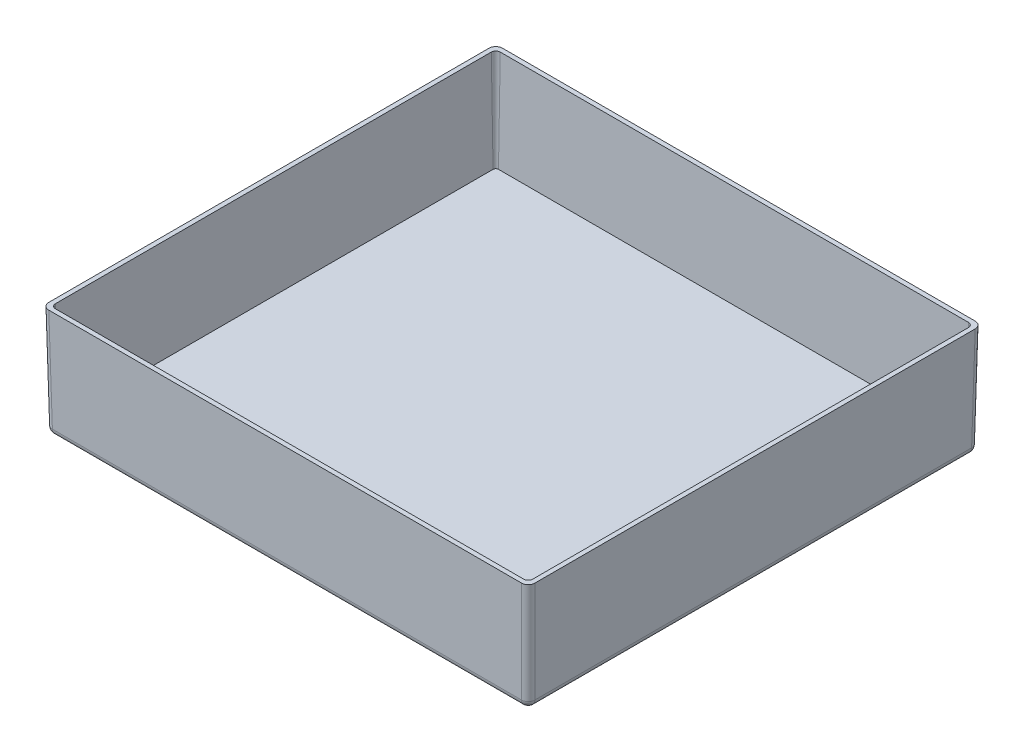
ISO-10303-21;
HEADER;
FILE_DESCRIPTION(('STEP AP214'),'2;1');
FILE_NAME('part.step','',(''),(''),'','','');
FILE_SCHEMA(('AUTOMOTIVE_DESIGN { 1 0 10303 214 1 1 1 1 }'));
ENDSEC;
DATA;
#1=APPLICATION_CONTEXT('core data for automotive mechanical design processes');
#2=APPLICATION_PROTOCOL_DEFINITION('international standard','automotive_design',2000,#1);
#3=PRODUCT_CONTEXT('',#1,'mechanical');
#4=PRODUCT('Part','Part','',(#3));
#5=PRODUCT_RELATED_PRODUCT_CATEGORY('part','',(#4));
#6=PRODUCT_DEFINITION_FORMATION('','',#4);
#7=PRODUCT_DEFINITION_CONTEXT('part definition',#1,'design');
#8=PRODUCT_DEFINITION('design','',#6,#7);
#9=PRODUCT_DEFINITION_SHAPE('','',#8);
#10=(LENGTH_UNIT() NAMED_UNIT(*) SI_UNIT(.MILLI.,.METRE.));
#11=(NAMED_UNIT(*) PLANE_ANGLE_UNIT() SI_UNIT($,.RADIAN.));
#12=(NAMED_UNIT(*) SI_UNIT($,.STERADIAN.) SOLID_ANGLE_UNIT());
#13=UNCERTAINTY_MEASURE_WITH_UNIT(LENGTH_MEASURE(1.E-05),#10,'distance_accuracy_value','');
#14=(GEOMETRIC_REPRESENTATION_CONTEXT(3) GLOBAL_UNCERTAINTY_ASSIGNED_CONTEXT((#13)) GLOBAL_UNIT_ASSIGNED_CONTEXT((#10,
#11,#12)) REPRESENTATION_CONTEXT('',''));
#15=CARTESIAN_POINT('',(0.,0.,0.));
#16=DIRECTION('',(0.,0.,1.));
#17=DIRECTION('',(1.,0.,0.));
#18=AXIS2_PLACEMENT_3D('',#15,#16,#17);
#19=CARTESIAN_POINT('',(107.75,0.,100.5));
#20=DIRECTION('',(0.999847695156391,-0.0174524064372835,0.));
#21=DIRECTION('',(0.0174524064372835,0.999847695156391,0.));
#22=AXIS2_PLACEMENT_3D('',#19,#20,#21);
#23=PLANE('',#22);
#24=DIRECTION('',(0.,0.,-1.));
#25=VECTOR('',#24,1.);
#26=CARTESIAN_POINT('',(107.801451296122,2.94764278068815,-100.5));
#27=LINE('',#26,#25);
#28=CARTESIAN_POINT('',(107.801451296122,2.94764278068815,97.551908210653));
#29=VERTEX_POINT('',#28);
#30=CARTESIAN_POINT('',(107.801451296122,2.94764278068815,-97.5519082106529));
#31=VERTEX_POINT('',#30);
#32=EDGE_CURVE('E280',#29,#31,#27,.T.);
#33=ORIENTED_EDGE('',*,*,#32,.T.);
#34=DIRECTION('',(0.0174497491606827,0.999695459881888,-0.0174497491606827));
#35=VECTOR('',#34,1.);
#36=CARTESIAN_POINT('',(107.68971009921,-3.45400610299427,-97.4401670137406));
#37=LINE('',#36,#35);
#38=CARTESIAN_POINT('',(108.605298181483,49.,-98.3557550960135));
#39=VERTEX_POINT('',#38);
#40=EDGE_CURVE('E282',#31,#39,#37,.T.);
#41=ORIENTED_EDGE('',*,*,#40,.T.);
#42=DIRECTION('',(0.,0.,1.));
#43=VECTOR('',#42,1.);
#44=CARTESIAN_POINT('',(108.605298181483,49.,0.));
#45=LINE('',#44,#43);
#46=CARTESIAN_POINT('',(108.605298181483,49.,98.3557550960135));
#47=VERTEX_POINT('',#46);
#48=EDGE_CURVE('E236',#47,#39,#45,.F.);
#49=ORIENTED_EDGE('',*,*,#48,.F.);
#50=DIRECTION('',(0.0174497491606827,0.999695459881888,0.0174497491606827));
#51=VECTOR('',#50,1.);
#52=CARTESIAN_POINT('',(107.75091334211,0.0523253344201977,97.5013702566405));
#53=LINE('',#52,#51);
#54=EDGE_CURVE('E278',#47,#29,#53,.F.);
#55=ORIENTED_EDGE('',*,*,#54,.T.);
#56=EDGE_LOOP('',(#33,#41,#49,#55));
#57=FACE_BOUND('',#56,.T.);
#58=ADVANCED_FACE('F37',(#57),#23,.T.);
#59=CARTESIAN_POINT('',(-107.75,0.,-100.5));
#60=DIRECTION('',(0.,-0.0174524064372835,-0.999847695156391));
#61=DIRECTION('',(0.,0.999847695156391,-0.0174524064372835));
#62=AXIS2_PLACEMENT_3D('',#59,#60,#61);
#63=PLANE('',#62);
#64=DIRECTION('',(-1.,0.,0.));
#65=VECTOR('',#64,1.);
#66=CARTESIAN_POINT('',(-107.75,2.94764278068815,-100.551451296122));
#67=LINE('',#66,#65);
#68=CARTESIAN_POINT('',(104.801908210653,2.94764278068815,-100.551451296122));
#69=VERTEX_POINT('',#68);
#70=CARTESIAN_POINT('',(-104.801908210653,2.94764278068815,-100.551451296122));
#71=VERTEX_POINT('',#70);
#72=EDGE_CURVE('E250',#69,#71,#67,.T.);
#73=ORIENTED_EDGE('',*,*,#72,.T.);
#74=DIRECTION('',(-0.0174497491606827,0.999695459881888,-0.0174497491606827));
#75=VECTOR('',#74,1.);
#76=CARTESIAN_POINT('',(-104.751370256641,0.0523253344201977,-100.50091334211));
#77=LINE('',#76,#75);
#78=CARTESIAN_POINT('',(-105.605755096014,49.,-101.355298181483));
#79=VERTEX_POINT('',#78);
#80=EDGE_CURVE('E253',#71,#79,#77,.T.);
#81=ORIENTED_EDGE('',*,*,#80,.T.);
#82=DIRECTION('',(1.,0.,0.));
#83=VECTOR('',#82,1.);
#84=CARTESIAN_POINT('',(0.,49.,-101.355298181483));
#85=LINE('',#84,#83);
#86=CARTESIAN_POINT('',(105.605755096013,49.,-101.355298181483));
#87=VERTEX_POINT('',#86);
#88=EDGE_CURVE('E239',#87,#79,#85,.F.);
#89=ORIENTED_EDGE('',*,*,#88,.F.);
#90=DIRECTION('',(0.0174497491606827,0.999695459881888,-0.0174497491606827));
#91=VECTOR('',#90,1.);
#92=CARTESIAN_POINT('',(104.685751854427,-3.70695041066845,-100.435294939896));
#93=LINE('',#92,#91);
#94=EDGE_CURVE('E248',#87,#69,#93,.F.);
#95=ORIENTED_EDGE('',*,*,#94,.T.);
#96=EDGE_LOOP('',(#73,#81,#89,#95));
#97=FACE_BOUND('',#96,.T.);
#98=ADVANCED_FACE('F341',(#97),#63,.T.);
#99=CARTESIAN_POINT('',(-107.75,0.,100.5));
#100=DIRECTION('',(-0.999847695156391,-0.0174524064372835,0.));
#101=DIRECTION('',(0.0174524064372835,-0.999847695156391,0.));
#102=AXIS2_PLACEMENT_3D('',#99,#100,#101);
#103=PLANE('',#102);
#104=DIRECTION('',(0.,0.,-1.));
#105=VECTOR('',#104,1.);
#106=CARTESIAN_POINT('',(-108.605298181483,49.,0.));
#107=LINE('',#106,#105);
#108=CARTESIAN_POINT('',(-108.605298181483,49.,-98.3557550960135));
#109=VERTEX_POINT('',#108);
#110=CARTESIAN_POINT('',(-108.605298181483,49.,98.3557550960135));
#111=VERTEX_POINT('',#110);
#112=EDGE_CURVE('E242',#109,#111,#107,.F.);
#113=ORIENTED_EDGE('',*,*,#112,.F.);
#114=DIRECTION('',(-0.0174497491606827,0.999695459881888,-0.0174497491606827));
#115=VECTOR('',#114,1.);
#116=CARTESIAN_POINT('',(-107.68971009921,-3.45400610299427,-97.4401670137405));
#117=LINE('',#116,#115);
#118=CARTESIAN_POINT('',(-107.801451296122,2.94764278068815,-97.5519082106529));
#119=VERTEX_POINT('',#118);
#120=EDGE_CURVE('E268',#109,#119,#117,.F.);
#121=ORIENTED_EDGE('',*,*,#120,.T.);
#122=DIRECTION('',(0.,0.,1.));
#123=VECTOR('',#122,1.);
#124=CARTESIAN_POINT('',(-107.801451296122,2.94764278068815,100.5));
#125=LINE('',#124,#123);
#126=CARTESIAN_POINT('',(-107.801451296122,2.94764278068815,97.551908210653));
#127=VERTEX_POINT('',#126);
#128=EDGE_CURVE('E266',#119,#127,#125,.T.);
#129=ORIENTED_EDGE('',*,*,#128,.T.);
#130=DIRECTION('',(-0.0174497491606827,0.999695459881888,0.0174497491606827));
#131=VECTOR('',#130,1.);
#132=CARTESIAN_POINT('',(-107.75091334211,0.0523253344201977,97.5013702566405));
#133=LINE('',#132,#131);
#134=EDGE_CURVE('E264',#127,#111,#133,.T.);
#135=ORIENTED_EDGE('',*,*,#134,.T.);
#136=EDGE_LOOP('',(#113,#121,#129,#135));
#137=FACE_BOUND('',#136,.T.);
#138=ADVANCED_FACE('F351',(#137),#103,.T.);
#139=CARTESIAN_POINT('',(-107.75,0.,100.5));
#140=DIRECTION('',(0.,-0.0174524064372835,0.999847695156391));
#141=DIRECTION('',(0.,-0.999847695156391,-0.0174524064372835));
#142=AXIS2_PLACEMENT_3D('',#139,#140,#141);
#143=PLANE('',#142);
#144=DIRECTION('',(1.,0.,0.));
#145=VECTOR('',#144,1.);
#146=CARTESIAN_POINT('',(107.75,2.94764278068815,100.551451296122));
#147=LINE('',#146,#145);
#148=CARTESIAN_POINT('',(-104.801908210653,2.94764278068815,100.551451296122));
#149=VERTEX_POINT('',#148);
#150=CARTESIAN_POINT('',(104.801908210653,2.94764278068815,100.551451296122));
#151=VERTEX_POINT('',#150);
#152=EDGE_CURVE('E46',#149,#151,#147,.T.);
#153=ORIENTED_EDGE('',*,*,#152,.T.);
#154=DIRECTION('',(0.0174497491606827,0.999695459881888,0.0174497491606827));
#155=VECTOR('',#154,1.);
#156=CARTESIAN_POINT('',(104.685751854427,-3.70695041066845,100.435294939896));
#157=LINE('',#156,#155);
#158=CARTESIAN_POINT('',(105.605755096013,49.,101.355298181483));
#159=VERTEX_POINT('',#158);
#160=EDGE_CURVE('E11',#151,#159,#157,.T.);
#161=ORIENTED_EDGE('',*,*,#160,.T.);
#162=DIRECTION('',(-1.,0.,0.));
#163=VECTOR('',#162,1.);
#164=CARTESIAN_POINT('',(0.,49.,101.355298181483));
#165=LINE('',#164,#163);
#166=CARTESIAN_POINT('',(-105.605755096014,49.,101.355298181483));
#167=VERTEX_POINT('',#166);
#168=EDGE_CURVE('E245',#167,#159,#165,.F.);
#169=ORIENTED_EDGE('',*,*,#168,.F.);
#170=DIRECTION('',(-0.0174497491606827,0.999695459881888,0.0174497491606827));
#171=VECTOR('',#170,1.);
#172=CARTESIAN_POINT('',(-104.751370256641,0.0523253344201977,100.50091334211));
#173=LINE('',#172,#171);
#174=EDGE_CURVE('E284',#167,#149,#173,.F.);
#175=ORIENTED_EDGE('',*,*,#174,.T.);
#176=EDGE_LOOP('',(#153,#161,#169,#175));
#177=FACE_BOUND('',#176,.T.);
#178=ADVANCED_FACE('F386',(#177),#143,.T.);
#179=CARTESIAN_POINT('',(0.,49.,0.));
#180=DIRECTION('',(0.,-1.,0.));
#181=DIRECTION('',(0.,0.,-1.));
#182=AXIS2_PLACEMENT_3D('',#179,#180,#181);
#183=PLANE('',#182);
#184=DIRECTION('',(1.,0.,0.));
#185=VECTOR('',#184,1.);
#186=CARTESIAN_POINT('',(-104.605298181483,49.,99.3552981814827));
#187=LINE('',#186,#185);
#188=CARTESIAN_POINT('',(-104.605298181483,49.,99.3552981814827));
#189=VERTEX_POINT('',#188);
#190=CARTESIAN_POINT('',(104.605298181483,49.,99.3552981814827));
#191=VERTEX_POINT('',#190);
#192=EDGE_CURVE('E177',#189,#191,#187,.T.);
#193=ORIENTED_EDGE('',*,*,#192,.F.);
#194=CARTESIAN_POINT('',(-104.605298181483,49.,97.3552981814827));
#195=DIRECTION('',(0.,1.,0.));
#196=DIRECTION('',(0.,0.,-1.));
#197=AXIS2_PLACEMENT_3D('',#194,#195,#196);
#198=CIRCLE('',#197,2.);
#199=CARTESIAN_POINT('',(-106.605298181483,49.,97.3552981814827));
#200=VERTEX_POINT('',#199);
#201=EDGE_CURVE('E54',#200,#189,#198,.T.);
#202=ORIENTED_EDGE('',*,*,#201,.F.);
#203=DIRECTION('',(0.,0.,1.));
#204=VECTOR('',#203,1.);
#205=CARTESIAN_POINT('',(-106.605298181483,49.,97.3552981814827));
#206=LINE('',#205,#204);
#207=CARTESIAN_POINT('',(-106.605298181483,49.,-97.3552981814826));
#208=VERTEX_POINT('',#207);
#209=EDGE_CURVE('E199',#208,#200,#206,.T.);
#210=ORIENTED_EDGE('',*,*,#209,.F.);
#211=CARTESIAN_POINT('',(-104.605298181483,49.,-97.3552981814827));
#212=DIRECTION('',(0.,1.,0.));
#213=DIRECTION('',(0.,0.,-1.));
#214=AXIS2_PLACEMENT_3D('',#211,#212,#213);
#215=CIRCLE('',#214,2.);
#216=CARTESIAN_POINT('',(-104.605298181483,49.,-99.3552981814827));
#217=VERTEX_POINT('',#216);
#218=EDGE_CURVE('E196',#217,#208,#215,.T.);
#219=ORIENTED_EDGE('',*,*,#218,.F.);
#220=DIRECTION('',(-1.,0.,0.));
#221=VECTOR('',#220,1.);
#222=CARTESIAN_POINT('',(-104.605298181483,49.,-99.3552981814827));
#223=LINE('',#222,#221);
#224=CARTESIAN_POINT('',(104.605298181483,49.,-99.3552981814827));
#225=VERTEX_POINT('',#224);
#226=EDGE_CURVE('E193',#225,#217,#223,.T.);
#227=ORIENTED_EDGE('',*,*,#226,.F.);
#228=CARTESIAN_POINT('',(104.605298181483,49.,-97.3552981814827));
#229=DIRECTION('',(0.,1.,0.));
#230=DIRECTION('',(0.,0.,-1.));
#231=AXIS2_PLACEMENT_3D('',#228,#229,#230);
#232=CIRCLE('',#231,2.);
#233=CARTESIAN_POINT('',(106.605298181483,49.,-97.3552981814826));
#234=VERTEX_POINT('',#233);
#235=EDGE_CURVE('E187',#234,#225,#232,.T.);
#236=ORIENTED_EDGE('',*,*,#235,.F.);
#237=DIRECTION('',(0.,0.,-1.));
#238=VECTOR('',#237,1.);
#239=CARTESIAN_POINT('',(106.605298181483,49.,97.3552981814827));
#240=LINE('',#239,#238);
#241=CARTESIAN_POINT('',(106.605298181483,49.,97.3552981814827));
#242=VERTEX_POINT('',#241);
#243=EDGE_CURVE('E185',#242,#234,#240,.T.);
#244=ORIENTED_EDGE('',*,*,#243,.F.);
#245=CARTESIAN_POINT('',(104.605298181483,49.,97.3552981814827));
#246=DIRECTION('',(0.,1.,0.));
#247=DIRECTION('',(0.,0.,1.));
#248=AXIS2_PLACEMENT_3D('',#245,#246,#247);
#249=CIRCLE('',#248,2.);
#250=EDGE_CURVE('E166',#191,#242,#249,.T.);
#251=ORIENTED_EDGE('',*,*,#250,.F.);
#252=EDGE_LOOP('',(#193,#202,#210,#219,#227,#236,#244,#251));
#253=FACE_BOUND('',#252,.T.);
#254=ORIENTED_EDGE('',*,*,#88,.T.);
#255=CARTESIAN_POINT('',(-105.604841197351,49.,-98.3548411973509));
#256=DIRECTION('',(0.,-1.,0.));
#257=DIRECTION('',(0.707106781186548,0.,0.707106781186548));
#258=AXIS2_PLACEMENT_3D('',#255,#256,#257);
#259=ELLIPSE('',#258,3.00091389867315,3.);
#260=EDGE_CURVE('E276',#79,#109,#259,.F.);
#261=ORIENTED_EDGE('',*,*,#260,.T.);
#262=ORIENTED_EDGE('',*,*,#112,.T.);
#263=CARTESIAN_POINT('',(-105.604841197351,49.,98.354841197351));
#264=DIRECTION('',(0.,-1.,0.));
#265=DIRECTION('',(0.707106781186548,0.,-0.707106781186548));
#266=AXIS2_PLACEMENT_3D('',#263,#264,#265);
#267=ELLIPSE('',#266,3.00091389867315,3.);
#268=EDGE_CURVE('E270',#111,#167,#267,.F.);
#269=ORIENTED_EDGE('',*,*,#268,.T.);
#270=ORIENTED_EDGE('',*,*,#168,.T.);
#271=CARTESIAN_POINT('',(105.604841197351,49.,98.354841197351));
#272=DIRECTION('',(0.,-1.,0.));
#273=DIRECTION('',(-0.707106781186548,0.,-0.707106781186548));
#274=AXIS2_PLACEMENT_3D('',#271,#272,#273);
#275=ELLIPSE('',#274,3.00091389867315,3.);
#276=EDGE_CURVE('E272',#159,#47,#275,.F.);
#277=ORIENTED_EDGE('',*,*,#276,.T.);
#278=ORIENTED_EDGE('',*,*,#48,.T.);
#279=CARTESIAN_POINT('',(105.604841197351,49.,-98.3548411973509));
#280=DIRECTION('',(0.,-1.,0.));
#281=DIRECTION('',(-0.707106781186548,0.,0.707106781186548));
#282=AXIS2_PLACEMENT_3D('',#279,#280,#281);
#283=ELLIPSE('',#282,3.00091389867315,3.);
#284=EDGE_CURVE('E274',#39,#87,#283,.F.);
#285=ORIENTED_EDGE('',*,*,#284,.T.);
#286=EDGE_LOOP('',(#254,#261,#262,#269,#270,#277,#278,#285));
#287=FACE_BOUND('',#286,.T.);
#288=ADVANCED_FACE('F181',(#253,#287),#183,.F.);
#289=CARTESIAN_POINT('',(0.,0.,0.));
#290=DIRECTION('',(0.,-1.,0.));
#291=DIRECTION('',(0.,0.,-1.));
#292=AXIS2_PLACEMENT_3D('',#289,#290,#291);
#293=PLANE('',#292);
#294=DIRECTION('',(0.,0.,-1.));
#295=VECTOR('',#294,1.);
#296=CARTESIAN_POINT('',(-104.801908210653,0.,-100.5));
#297=LINE('',#296,#295);
#298=CARTESIAN_POINT('',(-104.801908210653,0.,97.551908210653));
#299=VERTEX_POINT('',#298);
#300=CARTESIAN_POINT('',(-104.801908210653,0.,-97.5519082106529));
#301=VERTEX_POINT('',#300);
#302=EDGE_CURVE('E257',#299,#301,#297,.T.);
#303=ORIENTED_EDGE('',*,*,#302,.T.);
#304=DIRECTION('',(1.,0.,0.));
#305=VECTOR('',#304,1.);
#306=CARTESIAN_POINT('',(107.75,0.,-97.5519082106529));
#307=LINE('',#306,#305);
#308=CARTESIAN_POINT('',(104.801908210653,0.,-97.5519082106529));
#309=VERTEX_POINT('',#308);
#310=EDGE_CURVE('E261',#301,#309,#307,.T.);
#311=ORIENTED_EDGE('',*,*,#310,.T.);
#312=DIRECTION('',(0.,0.,1.));
#313=VECTOR('',#312,1.);
#314=CARTESIAN_POINT('',(104.801908210653,0.,100.5));
#315=LINE('',#314,#313);
#316=CARTESIAN_POINT('',(104.801908210653,0.,97.551908210653));
#317=VERTEX_POINT('',#316);
#318=EDGE_CURVE('E259',#309,#317,#315,.T.);
#319=ORIENTED_EDGE('',*,*,#318,.T.);
#320=DIRECTION('',(-1.,0.,0.));
#321=VECTOR('',#320,1.);
#322=CARTESIAN_POINT('',(-107.75,0.,97.551908210653));
#323=LINE('',#322,#321);
#324=EDGE_CURVE('E255',#317,#299,#323,.T.);
#325=ORIENTED_EDGE('',*,*,#324,.T.);
#326=EDGE_LOOP('',(#303,#311,#319,#325));
#327=FACE_BOUND('',#326,.T.);
#328=ADVANCED_FACE('F368',(#327),#293,.T.);
#329=CARTESIAN_POINT('',(104.75137025664,0.104682553732048,97.5013702566405));
#330=DIRECTION('',(-0.0174497491606827,-0.999695459881887,-0.0174497491606827));
#331=DIRECTION('',(0.,0.0174524064372835,-0.999847695156391));
#332=AXIS2_PLACEMENT_3D('',#329,#330,#331);
#333=CYLINDRICAL_SURFACE('',#332,3.);
#334=ORIENTED_EDGE('',*,*,#276,.F.);
#335=ORIENTED_EDGE('',*,*,#160,.F.);
#336=CARTESIAN_POINT('',(104.801908210653,3.,97.551908210653));
#337=DIRECTION('',(-0.0174497491606828,-0.999695459881888,-0.0174497491606828));
#338=DIRECTION('',(0.,0.0174524064372836,-0.999847695156391));
#339=AXIS2_PLACEMENT_3D('',#336,#337,#338);
#340=CIRCLE('',#339,3.);
#341=EDGE_CURVE('E313',#29,#151,#340,.T.);
#342=ORIENTED_EDGE('',*,*,#341,.F.);
#343=ORIENTED_EDGE('',*,*,#54,.F.);
#344=EDGE_LOOP('',(#334,#335,#342,#343));
#345=FACE_BOUND('',#344,.T.);
#346=ADVANCED_FACE('F39',(#345),#333,.T.);
#347=CARTESIAN_POINT('',(-104.751370256641,0.104682553732048,97.5013702566405));
#348=DIRECTION('',(0.0174497491606827,-0.999695459881887,-0.0174497491606827));
#349=DIRECTION('',(0.,0.0174524064372835,-0.999847695156391));
#350=AXIS2_PLACEMENT_3D('',#347,#348,#349);
#351=CYLINDRICAL_SURFACE('',#350,3.);
#352=ORIENTED_EDGE('',*,*,#268,.F.);
#353=ORIENTED_EDGE('',*,*,#134,.F.);
#354=CARTESIAN_POINT('',(-104.801908210653,3.,97.551908210653));
#355=DIRECTION('',(0.0174497491606828,-0.999695459881888,-0.0174497491606828));
#356=DIRECTION('',(0.,0.0174524064372836,-0.999847695156391));
#357=AXIS2_PLACEMENT_3D('',#354,#355,#356);
#358=CIRCLE('',#357,3.);
#359=EDGE_CURVE('E311',#149,#127,#358,.T.);
#360=ORIENTED_EDGE('',*,*,#359,.F.);
#361=ORIENTED_EDGE('',*,*,#174,.F.);
#362=EDGE_LOOP('',(#352,#353,#360,#361));
#363=FACE_BOUND('',#362,.T.);
#364=ADVANCED_FACE('F356',(#363),#351,.T.);
#365=CARTESIAN_POINT('',(-107.75,3.,97.551908210653));
#366=DIRECTION('',(1.,0.,0.));
#367=DIRECTION('',(0.,0.,-1.));
#368=AXIS2_PLACEMENT_3D('',#365,#366,#367);
#369=CYLINDRICAL_SURFACE('',#368,3.);
#370=CARTESIAN_POINT('',(104.801908210653,3.,97.551908210653));
#371=DIRECTION('',(1.,0.,0.));
#372=DIRECTION('',(0.,0.,-1.));
#373=AXIS2_PLACEMENT_3D('',#370,#371,#372);
#374=CIRCLE('',#373,3.);
#375=EDGE_CURVE('E41',#151,#317,#374,.T.);
#376=ORIENTED_EDGE('',*,*,#375,.F.);
#377=ORIENTED_EDGE('',*,*,#152,.F.);
#378=CARTESIAN_POINT('',(-104.801908210653,3.,97.551908210653));
#379=DIRECTION('',(-1.,0.,0.));
#380=DIRECTION('',(0.,0.,1.));
#381=AXIS2_PLACEMENT_3D('',#378,#379,#380);
#382=CIRCLE('',#381,3.);
#383=EDGE_CURVE('E308',#299,#149,#382,.T.);
#384=ORIENTED_EDGE('',*,*,#383,.F.);
#385=ORIENTED_EDGE('',*,*,#324,.F.);
#386=EDGE_LOOP('',(#376,#377,#384,#385));
#387=FACE_BOUND('',#386,.T.);
#388=ADVANCED_FACE('F369',(#387),#369,.T.);
#389=CARTESIAN_POINT('',(104.801908210653,3.,97.551908210653));
#390=DIRECTION('',(0.,-1.,0.));
#391=DIRECTION('',(0.,0.,-1.));
#392=AXIS2_PLACEMENT_3D('',#389,#390,#391);
#393=SPHERICAL_SURFACE('',#392,3.);
#394=ORIENTED_EDGE('',*,*,#341,.T.);
#395=ORIENTED_EDGE('',*,*,#375,.T.);
#396=CARTESIAN_POINT('',(104.801908210653,3.,97.551908210653));
#397=DIRECTION('',(0.,0.,1.));
#398=DIRECTION('',(1.,0.,0.));
#399=AXIS2_PLACEMENT_3D('',#396,#397,#398);
#400=CIRCLE('',#399,3.);
#401=EDGE_CURVE('E305',#29,#317,#400,.F.);
#402=ORIENTED_EDGE('',*,*,#401,.F.);
#403=EDGE_LOOP('',(#394,#395,#402));
#404=FACE_BOUND('',#403,.T.);
#405=ADVANCED_FACE('F320',(#404),#393,.T.);
#406=CARTESIAN_POINT('',(-104.801908210653,3.,97.551908210653));
#407=DIRECTION('',(0.,-1.,0.));
#408=DIRECTION('',(0.,0.,-1.));
#409=AXIS2_PLACEMENT_3D('',#406,#407,#408);
#410=SPHERICAL_SURFACE('',#409,3.);
#411=ORIENTED_EDGE('',*,*,#383,.T.);
#412=ORIENTED_EDGE('',*,*,#359,.T.);
#413=CARTESIAN_POINT('',(-104.801908210653,3.,97.551908210653));
#414=DIRECTION('',(0.,0.,1.));
#415=DIRECTION('',(1.,0.,0.));
#416=AXIS2_PLACEMENT_3D('',#413,#414,#415);
#417=CIRCLE('',#416,3.);
#418=EDGE_CURVE('E302',#299,#127,#417,.F.);
#419=ORIENTED_EDGE('',*,*,#418,.F.);
#420=EDGE_LOOP('',(#411,#412,#419));
#421=FACE_BOUND('',#420,.T.);
#422=ADVANCED_FACE('F360',(#421),#410,.T.);
#423=CARTESIAN_POINT('',(104.801908210653,3.,100.5));
#424=DIRECTION('',(0.,0.,-1.));
#425=DIRECTION('',(-1.,0.,0.));
#426=AXIS2_PLACEMENT_3D('',#423,#424,#425);
#427=CYLINDRICAL_SURFACE('',#426,3.);
#428=ORIENTED_EDGE('',*,*,#401,.T.);
#429=ORIENTED_EDGE('',*,*,#318,.F.);
#430=CARTESIAN_POINT('',(104.801908210653,3.,-97.5519082106529));
#431=DIRECTION('',(0.,0.,-1.));
#432=DIRECTION('',(-1.,0.,0.));
#433=AXIS2_PLACEMENT_3D('',#430,#431,#432);
#434=CIRCLE('',#433,3.);
#435=EDGE_CURVE('E299',#31,#309,#434,.T.);
#436=ORIENTED_EDGE('',*,*,#435,.F.);
#437=ORIENTED_EDGE('',*,*,#32,.F.);
#438=EDGE_LOOP('',(#428,#429,#436,#437));
#439=FACE_BOUND('',#438,.T.);
#440=ADVANCED_FACE('F326',(#439),#427,.T.);
#441=CARTESIAN_POINT('',(104.685751854427,-3.6545931913566,-97.4357518544269));
#442=DIRECTION('',(-0.0174497491606827,-0.999695459881887,0.0174497491606827));
#443=DIRECTION('',(0.,-0.0174524064372835,-0.999847695156391));
#444=AXIS2_PLACEMENT_3D('',#441,#442,#443);
#445=CYLINDRICAL_SURFACE('',#444,3.);
#446=ORIENTED_EDGE('',*,*,#284,.F.);
#447=ORIENTED_EDGE('',*,*,#40,.F.);
#448=CARTESIAN_POINT('',(104.801908210653,3.,-97.5519082106529));
#449=DIRECTION('',(-0.0174497491606829,-0.999695459881888,0.0174497491606828));
#450=DIRECTION('',(0.999847695156391,-0.0174524064372838,0.));
#451=AXIS2_PLACEMENT_3D('',#448,#449,#450);
#452=CIRCLE('',#451,3.);
#453=EDGE_CURVE('E296',#69,#31,#452,.T.);
#454=ORIENTED_EDGE('',*,*,#453,.F.);
#455=ORIENTED_EDGE('',*,*,#94,.F.);
#456=EDGE_LOOP('',(#446,#447,#454,#455));
#457=FACE_BOUND('',#456,.T.);
#458=ADVANCED_FACE('F335',(#457),#445,.T.);
#459=CARTESIAN_POINT('',(-104.690167013741,-3.40164888368242,-97.4401670137406));
#460=DIRECTION('',(0.0174497491606827,-0.999695459881887,0.0174497491606827));
#461=DIRECTION('',(0.,-0.0174524064372835,-0.999847695156391));
#462=AXIS2_PLACEMENT_3D('',#459,#460,#461);
#463=CYLINDRICAL_SURFACE('',#462,3.);
#464=ORIENTED_EDGE('',*,*,#260,.F.);
#465=ORIENTED_EDGE('',*,*,#80,.F.);
#466=CARTESIAN_POINT('',(-104.801908210653,3.,-97.5519082106529));
#467=DIRECTION('',(0.0174497491606828,-0.999695459881887,0.0174497491606826));
#468=DIRECTION('',(0.999847695156391,0.0174524064372836,0.));
#469=AXIS2_PLACEMENT_3D('',#466,#467,#468);
#470=CIRCLE('',#469,3.);
#471=EDGE_CURVE('E293',#119,#71,#470,.T.);
#472=ORIENTED_EDGE('',*,*,#471,.F.);
#473=ORIENTED_EDGE('',*,*,#120,.F.);
#474=EDGE_LOOP('',(#464,#465,#472,#473));
#475=FACE_BOUND('',#474,.T.);
#476=ADVANCED_FACE('F346',(#475),#463,.T.);
#477=CARTESIAN_POINT('',(-104.801908210653,3.,100.5));
#478=DIRECTION('',(0.,0.,1.));
#479=DIRECTION('',(1.,0.,0.));
#480=AXIS2_PLACEMENT_3D('',#477,#478,#479);
#481=CYLINDRICAL_SURFACE('',#480,3.);
#482=ORIENTED_EDGE('',*,*,#418,.T.);
#483=ORIENTED_EDGE('',*,*,#128,.F.);
#484=CARTESIAN_POINT('',(-104.801908210653,3.,-97.5519082106529));
#485=DIRECTION('',(0.,0.,-1.));
#486=DIRECTION('',(-1.,0.,0.));
#487=AXIS2_PLACEMENT_3D('',#484,#485,#486);
#488=CIRCLE('',#487,3.);
#489=EDGE_CURVE('E290',#301,#119,#488,.T.);
#490=ORIENTED_EDGE('',*,*,#489,.F.);
#491=ORIENTED_EDGE('',*,*,#302,.F.);
#492=EDGE_LOOP('',(#482,#483,#490,#491));
#493=FACE_BOUND('',#492,.T.);
#494=ADVANCED_FACE('F364',(#493),#481,.T.);
#495=CARTESIAN_POINT('',(104.801908210653,3.,-97.5519082106529));
#496=DIRECTION('',(0.,-1.,0.));
#497=DIRECTION('',(0.,0.,-1.));
#498=AXIS2_PLACEMENT_3D('',#495,#496,#497);
#499=SPHERICAL_SURFACE('',#498,3.);
#500=ORIENTED_EDGE('',*,*,#453,.T.);
#501=ORIENTED_EDGE('',*,*,#435,.T.);
#502=CARTESIAN_POINT('',(104.801908210653,3.,-97.5519082106529));
#503=DIRECTION('',(1.,0.,0.));
#504=DIRECTION('',(0.,0.,-1.));
#505=AXIS2_PLACEMENT_3D('',#502,#503,#504);
#506=CIRCLE('',#505,3.);
#507=EDGE_CURVE('E288',#69,#309,#506,.F.);
#508=ORIENTED_EDGE('',*,*,#507,.F.);
#509=EDGE_LOOP('',(#500,#501,#508));
#510=FACE_BOUND('',#509,.T.);
#511=ADVANCED_FACE('F399',(#510),#499,.T.);
#512=CARTESIAN_POINT('',(-104.801908210653,3.,-97.5519082106529));
#513=DIRECTION('',(0.,-1.,0.));
#514=DIRECTION('',(0.,0.,-1.));
#515=AXIS2_PLACEMENT_3D('',#512,#513,#514);
#516=SPHERICAL_SURFACE('',#515,3.);
#517=ORIENTED_EDGE('',*,*,#489,.T.);
#518=ORIENTED_EDGE('',*,*,#471,.T.);
#519=CARTESIAN_POINT('',(-104.801908210653,3.,-97.5519082106529));
#520=DIRECTION('',(-1.,0.,0.));
#521=DIRECTION('',(0.,0.,1.));
#522=AXIS2_PLACEMENT_3D('',#519,#520,#521);
#523=CIRCLE('',#522,3.);
#524=EDGE_CURVE('E205',#301,#71,#523,.F.);
#525=ORIENTED_EDGE('',*,*,#524,.F.);
#526=EDGE_LOOP('',(#517,#518,#525));
#527=FACE_BOUND('',#526,.T.);
#528=ADVANCED_FACE('F395',(#527),#516,.T.);
#529=CARTESIAN_POINT('',(-107.75,3.,-97.5519082106529));
#530=DIRECTION('',(-1.,0.,0.));
#531=DIRECTION('',(0.,0.,1.));
#532=AXIS2_PLACEMENT_3D('',#529,#530,#531);
#533=CYLINDRICAL_SURFACE('',#532,3.);
#534=ORIENTED_EDGE('',*,*,#507,.T.);
#535=ORIENTED_EDGE('',*,*,#310,.F.);
#536=ORIENTED_EDGE('',*,*,#524,.T.);
#537=ORIENTED_EDGE('',*,*,#72,.F.);
#538=EDGE_LOOP('',(#534,#535,#536,#537));
#539=FACE_BOUND('',#538,.T.);
#540=ADVANCED_FACE('F391',(#539),#533,.T.);
#541=CARTESIAN_POINT('',(-104.605298181483,49.,97.3552981814827));
#542=DIRECTION('',(0.,1.,0.));
#543=DIRECTION('',(0.,0.,-1.));
#544=AXIS2_PLACEMENT_3D('',#541,#542,#543);
#545=CONICAL_SURFACE('',#544,2.,0.0174532925199433);
#546=ORIENTED_EDGE('',*,*,#201,.T.);
#547=DIRECTION('',(0.,0.999847695156391,0.0174524064372835));
#548=VECTOR('',#547,1.);
#549=CARTESIAN_POINT('',(-104.605298181483,49.,99.3552981814827));
#550=LINE('',#549,#548);
#551=CARTESIAN_POINT('',(-104.605298181483,4.,98.5698202597129));
#552=VERTEX_POINT('',#551);
#553=EDGE_CURVE('E174',#552,#189,#550,.T.);
#554=ORIENTED_EDGE('',*,*,#553,.F.);
#555=CARTESIAN_POINT('',(-104.605298181483,4.,97.3552981814827));
#556=DIRECTION('',(0.,-1.,0.));
#557=DIRECTION('',(0.,0.,-1.));
#558=AXIS2_PLACEMENT_3D('',#555,#556,#557);
#559=CIRCLE('',#558,1.21452207823021);
#560=CARTESIAN_POINT('',(-105.819820259713,4.,97.3552981814827));
#561=VERTEX_POINT('',#560);
#562=EDGE_CURVE('E202',#561,#552,#559,.F.);
#563=ORIENTED_EDGE('',*,*,#562,.F.);
#564=DIRECTION('',(-0.0174524064372835,0.999847695156391,0.));
#565=VECTOR('',#564,1.);
#566=CARTESIAN_POINT('',(-106.605298181483,49.,97.3552981814827));
#567=LINE('',#566,#565);
#568=EDGE_CURVE('E203',#561,#200,#567,.T.);
#569=ORIENTED_EDGE('',*,*,#568,.T.);
#570=EDGE_LOOP('',(#546,#554,#563,#569));
#571=FACE_BOUND('',#570,.T.);
#572=ADVANCED_FACE('F394',(#571),#545,.F.);
#573=CARTESIAN_POINT('',(-106.605298181483,49.,97.3552981814827));
#574=DIRECTION('',(-0.999847695156391,-0.0174524064372835,0.));
#575=DIRECTION('',(0.0174524064372836,-0.999847695156391,0.));
#576=AXIS2_PLACEMENT_3D('',#573,#574,#575);
#577=PLANE('',#576);
#578=ORIENTED_EDGE('',*,*,#209,.T.);
#579=ORIENTED_EDGE('',*,*,#568,.F.);
#580=DIRECTION('',(0.,0.,1.));
#581=VECTOR('',#580,1.);
#582=CARTESIAN_POINT('',(-105.819820259713,4.,97.3552981814827));
#583=LINE('',#582,#581);
#584=CARTESIAN_POINT('',(-105.819820259713,4.,-97.3552981814826));
#585=VERTEX_POINT('',#584);
#586=EDGE_CURVE('E207',#585,#561,#583,.T.);
#587=ORIENTED_EDGE('',*,*,#586,.F.);
#588=DIRECTION('',(-0.0174524064372835,0.999847695156391,0.));
#589=VECTOR('',#588,1.);
#590=CARTESIAN_POINT('',(-106.605298181483,49.,-97.3552981814826));
#591=LINE('',#590,#589);
#592=EDGE_CURVE('E206',#585,#208,#591,.T.);
#593=ORIENTED_EDGE('',*,*,#592,.T.);
#594=EDGE_LOOP('',(#578,#579,#587,#593));
#595=FACE_BOUND('',#594,.T.);
#596=ADVANCED_FACE('F452',(#595),#577,.F.);
#597=CARTESIAN_POINT('',(-104.605298181483,49.,-97.3552981814827));
#598=DIRECTION('',(0.,1.,0.));
#599=DIRECTION('',(0.,0.,-1.));
#600=AXIS2_PLACEMENT_3D('',#597,#598,#599);
#601=CONICAL_SURFACE('',#600,2.,0.0174532925199433);
#602=ORIENTED_EDGE('',*,*,#218,.T.);
#603=ORIENTED_EDGE('',*,*,#592,.F.);
#604=CARTESIAN_POINT('',(-104.605298181483,4.,-97.3552981814827));
#605=DIRECTION('',(0.,-1.,0.));
#606=DIRECTION('',(0.,0.,-1.));
#607=AXIS2_PLACEMENT_3D('',#604,#605,#606);
#608=CIRCLE('',#607,1.21452207823021);
#609=CARTESIAN_POINT('',(-104.605298181483,4.,-98.5698202597129));
#610=VERTEX_POINT('',#609);
#611=EDGE_CURVE('E222',#610,#585,#608,.F.);
#612=ORIENTED_EDGE('',*,*,#611,.F.);
#613=DIRECTION('',(0.,0.999847695156391,-0.0174524064372835));
#614=VECTOR('',#613,1.);
#615=CARTESIAN_POINT('',(-104.605298181483,49.,-99.3552981814827));
#616=LINE('',#615,#614);
#617=EDGE_CURVE('E214',#610,#217,#616,.T.);
#618=ORIENTED_EDGE('',*,*,#617,.T.);
#619=EDGE_LOOP('',(#602,#603,#612,#618));
#620=FACE_BOUND('',#619,.T.);
#621=ADVANCED_FACE('F459',(#620),#601,.F.);
#622=CARTESIAN_POINT('',(-104.605298181483,49.,-99.3552981814827));
#623=DIRECTION('',(0.,-0.0174524064372835,-0.999847695156391));
#624=DIRECTION('',(0.,0.999847695156391,-0.0174524064372835));
#625=AXIS2_PLACEMENT_3D('',#622,#623,#624);
#626=PLANE('',#625);
#627=ORIENTED_EDGE('',*,*,#226,.T.);
#628=ORIENTED_EDGE('',*,*,#617,.F.);
#629=DIRECTION('',(-1.,0.,0.));
#630=VECTOR('',#629,1.);
#631=CARTESIAN_POINT('',(-104.605298181483,4.,-98.5698202597129));
#632=LINE('',#631,#630);
#633=CARTESIAN_POINT('',(104.605298181483,4.,-98.5698202597129));
#634=VERTEX_POINT('',#633);
#635=EDGE_CURVE('E225',#634,#610,#632,.T.);
#636=ORIENTED_EDGE('',*,*,#635,.F.);
#637=DIRECTION('',(0.,0.999847695156391,-0.0174524064372835));
#638=VECTOR('',#637,1.);
#639=CARTESIAN_POINT('',(104.605298181483,49.,-99.3552981814827));
#640=LINE('',#639,#638);
#641=EDGE_CURVE('E212',#634,#225,#640,.T.);
#642=ORIENTED_EDGE('',*,*,#641,.T.);
#643=EDGE_LOOP('',(#627,#628,#636,#642));
#644=FACE_BOUND('',#643,.T.);
#645=ADVANCED_FACE('F467',(#644),#626,.F.);
#646=CARTESIAN_POINT('',(104.605298181483,49.,-97.3552981814827));
#647=DIRECTION('',(0.,1.,0.));
#648=DIRECTION('',(0.,0.,-1.));
#649=AXIS2_PLACEMENT_3D('',#646,#647,#648);
#650=CONICAL_SURFACE('',#649,2.,0.0174532925199433);
#651=ORIENTED_EDGE('',*,*,#235,.T.);
#652=ORIENTED_EDGE('',*,*,#641,.F.);
#653=CARTESIAN_POINT('',(104.605298181483,4.,-97.3552981814827));
#654=DIRECTION('',(0.,-1.,0.));
#655=DIRECTION('',(0.,0.,-1.));
#656=AXIS2_PLACEMENT_3D('',#653,#654,#655);
#657=CIRCLE('',#656,1.21452207823021);
#658=CARTESIAN_POINT('',(105.819820259713,4.,-97.3552981814826));
#659=VERTEX_POINT('',#658);
#660=EDGE_CURVE('E228',#659,#634,#657,.F.);
#661=ORIENTED_EDGE('',*,*,#660,.F.);
#662=DIRECTION('',(0.0174524064372835,0.999847695156391,0.));
#663=VECTOR('',#662,1.);
#664=CARTESIAN_POINT('',(106.605298181483,49.,-97.3552981814826));
#665=LINE('',#664,#663);
#666=EDGE_CURVE('E210',#659,#234,#665,.T.);
#667=ORIENTED_EDGE('',*,*,#666,.T.);
#668=EDGE_LOOP('',(#651,#652,#661,#667));
#669=FACE_BOUND('',#668,.T.);
#670=ADVANCED_FACE('F475',(#669),#650,.F.);
#671=CARTESIAN_POINT('',(106.605298181483,49.,97.3552981814827));
#672=DIRECTION('',(0.999847695156391,-0.0174524064372835,0.));
#673=DIRECTION('',(0.0174524064372836,0.999847695156391,0.));
#674=AXIS2_PLACEMENT_3D('',#671,#672,#673);
#675=PLANE('',#674);
#676=ORIENTED_EDGE('',*,*,#243,.T.);
#677=ORIENTED_EDGE('',*,*,#666,.F.);
#678=DIRECTION('',(0.,0.,-1.));
#679=VECTOR('',#678,1.);
#680=CARTESIAN_POINT('',(105.819820259713,4.,97.3552981814827));
#681=LINE('',#680,#679);
#682=CARTESIAN_POINT('',(105.819820259713,4.,97.3552981814827));
#683=VERTEX_POINT('',#682);
#684=EDGE_CURVE('E231',#683,#659,#681,.T.);
#685=ORIENTED_EDGE('',*,*,#684,.F.);
#686=DIRECTION('',(0.0174524064372835,0.999847695156391,0.));
#687=VECTOR('',#686,1.);
#688=CARTESIAN_POINT('',(106.605298181483,49.,97.3552981814827));
#689=LINE('',#688,#687);
#690=EDGE_CURVE('E173',#683,#242,#689,.T.);
#691=ORIENTED_EDGE('',*,*,#690,.T.);
#692=EDGE_LOOP('',(#676,#677,#685,#691));
#693=FACE_BOUND('',#692,.T.);
#694=ADVANCED_FACE('F483',(#693),#675,.F.);
#695=CARTESIAN_POINT('',(104.605298181483,49.,97.3552981814827));
#696=DIRECTION('',(0.,1.,0.));
#697=DIRECTION('',(0.,0.,1.));
#698=AXIS2_PLACEMENT_3D('',#695,#696,#697);
#699=CONICAL_SURFACE('',#698,2.,0.0174532925199433);
#700=ORIENTED_EDGE('',*,*,#250,.T.);
#701=ORIENTED_EDGE('',*,*,#690,.F.);
#702=CARTESIAN_POINT('',(104.605298181483,4.,97.3552981814827));
#703=DIRECTION('',(0.,-1.,0.));
#704=DIRECTION('',(0.,0.,-1.));
#705=AXIS2_PLACEMENT_3D('',#702,#703,#704);
#706=CIRCLE('',#705,1.21452207823021);
#707=CARTESIAN_POINT('',(104.605298181483,4.,98.5698202597129));
#708=VERTEX_POINT('',#707);
#709=EDGE_CURVE('E169',#708,#683,#706,.F.);
#710=ORIENTED_EDGE('',*,*,#709,.F.);
#711=DIRECTION('',(0.,0.999847695156391,0.0174524064372835));
#712=VECTOR('',#711,1.);
#713=CARTESIAN_POINT('',(104.605298181483,49.,99.3552981814827));
#714=LINE('',#713,#712);
#715=EDGE_CURVE('E162',#708,#191,#714,.T.);
#716=ORIENTED_EDGE('',*,*,#715,.T.);
#717=EDGE_LOOP('',(#700,#701,#710,#716));
#718=FACE_BOUND('',#717,.T.);
#719=ADVANCED_FACE('F164',(#718),#699,.F.);
#720=CARTESIAN_POINT('',(-104.605298181483,49.,99.3552981814827));
#721=DIRECTION('',(0.,-0.0174524064372835,0.999847695156391));
#722=DIRECTION('',(0.,-0.999847695156391,-0.0174524064372835));
#723=AXIS2_PLACEMENT_3D('',#720,#721,#722);
#724=PLANE('',#723);
#725=ORIENTED_EDGE('',*,*,#192,.T.);
#726=ORIENTED_EDGE('',*,*,#715,.F.);
#727=DIRECTION('',(1.,0.,0.));
#728=VECTOR('',#727,1.);
#729=CARTESIAN_POINT('',(-104.605298181483,4.,98.5698202597129));
#730=LINE('',#729,#728);
#731=EDGE_CURVE('E219',#552,#708,#730,.T.);
#732=ORIENTED_EDGE('',*,*,#731,.F.);
#733=ORIENTED_EDGE('',*,*,#553,.T.);
#734=EDGE_LOOP('',(#725,#726,#732,#733));
#735=FACE_BOUND('',#734,.T.);
#736=ADVANCED_FACE('F178',(#735),#724,.F.);
#737=CARTESIAN_POINT('',(-104.605298181483,4.,97.3552981814827));
#738=DIRECTION('',(0.,-1.,0.));
#739=DIRECTION('',(0.,0.,-1.));
#740=AXIS2_PLACEMENT_3D('',#737,#738,#739);
#741=PLANE('',#740);
#742=ORIENTED_EDGE('',*,*,#562,.T.);
#743=ORIENTED_EDGE('',*,*,#731,.T.);
#744=ORIENTED_EDGE('',*,*,#709,.T.);
#745=ORIENTED_EDGE('',*,*,#684,.T.);
#746=ORIENTED_EDGE('',*,*,#660,.T.);
#747=ORIENTED_EDGE('',*,*,#635,.T.);
#748=ORIENTED_EDGE('',*,*,#611,.T.);
#749=ORIENTED_EDGE('',*,*,#586,.T.);
#750=EDGE_LOOP('',(#742,#743,#744,#745,#746,#747,#748,#749));
#751=FACE_BOUND('',#750,.T.);
#752=ADVANCED_FACE('F504',(#751),#741,.F.);
#753=CLOSED_SHELL('',(#58,#98,#138,#178,#288,#328,#346,#364,#388,#405,#422,#440,#458,#476,#494,
#511,#528,#540,#572,#596,#621,#645,#670,#694,#719,#736,#752));
#754=MANIFOLD_SOLID_BREP('B2',#753);
#755=ADVANCED_BREP_SHAPE_REPRESENTATION('',(#18,#754),#14);
#756=SHAPE_DEFINITION_REPRESENTATION(#9,#755);
ENDSEC;
END-ISO-10303-21;
